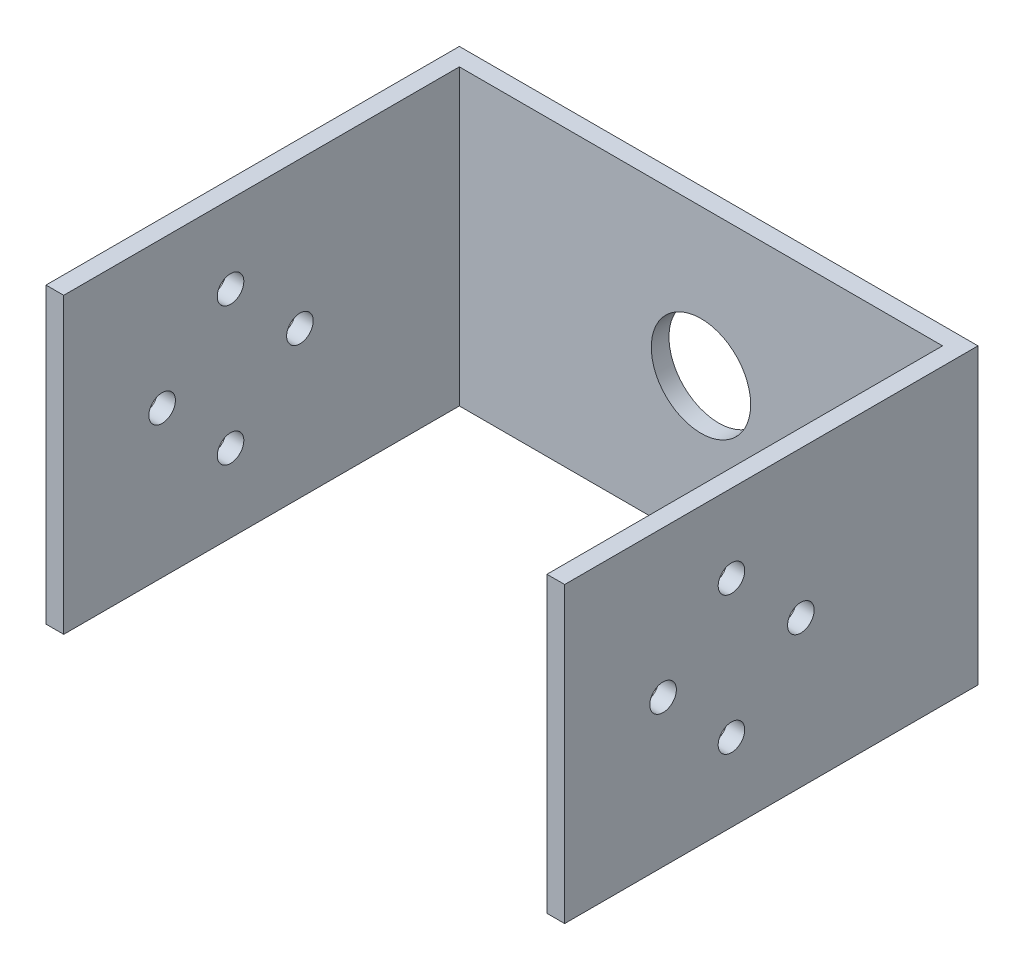
ISO-10303-21;
HEADER;
FILE_DESCRIPTION(('STEP AP214'),'2;1');
FILE_NAME('part.step','',(''),(''),'','','');
FILE_SCHEMA(('AUTOMOTIVE_DESIGN { 1 0 10303 214 1 1 1 1 }'));
ENDSEC;
DATA;
#1=APPLICATION_CONTEXT('core data for automotive mechanical design processes');
#2=APPLICATION_PROTOCOL_DEFINITION('international standard','automotive_design',2000,#1);
#3=PRODUCT_CONTEXT('',#1,'mechanical');
#4=PRODUCT('Part','Part','',(#3));
#5=PRODUCT_RELATED_PRODUCT_CATEGORY('part','',(#4));
#6=PRODUCT_DEFINITION_FORMATION('','',#4);
#7=PRODUCT_DEFINITION_CONTEXT('part definition',#1,'design');
#8=PRODUCT_DEFINITION('design','',#6,#7);
#9=PRODUCT_DEFINITION_SHAPE('','',#8);
#10=(LENGTH_UNIT() NAMED_UNIT(*) SI_UNIT(.MILLI.,.METRE.));
#11=(NAMED_UNIT(*) PLANE_ANGLE_UNIT() SI_UNIT($,.RADIAN.));
#12=(NAMED_UNIT(*) SI_UNIT($,.STERADIAN.) SOLID_ANGLE_UNIT());
#13=UNCERTAINTY_MEASURE_WITH_UNIT(LENGTH_MEASURE(1.E-05),#10,'distance_accuracy_value','');
#14=(GEOMETRIC_REPRESENTATION_CONTEXT(3) GLOBAL_UNCERTAINTY_ASSIGNED_CONTEXT((#13)) GLOBAL_UNIT_ASSIGNED_CONTEXT((#10,
#11,#12)) REPRESENTATION_CONTEXT('',''));
#15=CARTESIAN_POINT('',(0.,0.,0.));
#16=DIRECTION('',(0.,0.,1.));
#17=DIRECTION('',(1.,0.,0.));
#18=AXIS2_PLACEMENT_3D('',#15,#16,#17);
#19=CARTESIAN_POINT('',(0.,0.,1.8));
#20=DIRECTION('',(0.,0.,-1.));
#21=DIRECTION('',(-1.,0.,0.));
#22=AXIS2_PLACEMENT_3D('',#19,#20,#21);
#23=PLANE('',#22);
#24=DIRECTION('',(0.,1.,0.));
#25=VECTOR('',#24,1.);
#26=CARTESIAN_POINT('',(24.55,-14.92,1.8));
#27=LINE('',#26,#25);
#28=CARTESIAN_POINT('',(24.55,-14.92,1.8));
#29=VERTEX_POINT('',#28);
#30=CARTESIAN_POINT('',(24.55,14.92,1.8));
#31=VERTEX_POINT('',#30);
#32=EDGE_CURVE('E183',#29,#31,#27,.T.);
#33=ORIENTED_EDGE('',*,*,#32,.T.);
#34=DIRECTION('',(-1.,0.,0.));
#35=VECTOR('',#34,1.);
#36=CARTESIAN_POINT('',(-24.55,14.92,1.8));
#37=LINE('',#36,#35);
#38=CARTESIAN_POINT('',(-24.55,14.92,1.8));
#39=VERTEX_POINT('',#38);
#40=EDGE_CURVE('E186',#31,#39,#37,.T.);
#41=ORIENTED_EDGE('',*,*,#40,.T.);
#42=DIRECTION('',(0.,-1.,0.));
#43=VECTOR('',#42,1.);
#44=CARTESIAN_POINT('',(-24.55,-14.92,1.8));
#45=LINE('',#44,#43);
#46=CARTESIAN_POINT('',(-24.55,-14.92,1.8));
#47=VERTEX_POINT('',#46);
#48=EDGE_CURVE('E46',#39,#47,#45,.T.);
#49=ORIENTED_EDGE('',*,*,#48,.T.);
#50=DIRECTION('',(1.,0.,0.));
#51=VECTOR('',#50,1.);
#52=CARTESIAN_POINT('',(-24.55,-14.92,1.8));
#53=LINE('',#52,#51);
#54=EDGE_CURVE('E11',#47,#29,#53,.T.);
#55=ORIENTED_EDGE('',*,*,#54,.T.);
#56=EDGE_LOOP('',(#33,#41,#49,#55));
#57=FACE_BOUND('',#56,.T.);
#58=CARTESIAN_POINT('',(0.,0.,1.8));
#59=DIRECTION('',(0.,0.,1.));
#60=DIRECTION('',(1.,0.,0.));
#61=AXIS2_PLACEMENT_3D('',#58,#59,#60);
#62=CIRCLE('',#61,5.05);
#63=CARTESIAN_POINT('',(5.05,0.,1.8));
#64=VERTEX_POINT('',#63);
#65=EDGE_CURVE('E177',#64,#64,#62,.T.);
#66=ORIENTED_EDGE('',*,*,#65,.F.);
#67=EDGE_LOOP('',(#66));
#68=FACE_BOUND('',#67,.T.);
#69=ADVANCED_FACE('F37',(#57,#68),#23,.F.);
#70=CARTESIAN_POINT('',(0.,0.,0.));
#71=DIRECTION('',(0.,0.,-1.));
#72=DIRECTION('',(-1.,0.,0.));
#73=AXIS2_PLACEMENT_3D('',#70,#71,#72);
#74=PLANE('',#73);
#75=DIRECTION('',(-1.,0.,0.));
#76=VECTOR('',#75,1.);
#77=CARTESIAN_POINT('',(-24.55,14.92,0.));
#78=LINE('',#77,#76);
#79=CARTESIAN_POINT('',(26.35,14.92,0.));
#80=VERTEX_POINT('',#79);
#81=CARTESIAN_POINT('',(-26.35,14.92,0.));
#82=VERTEX_POINT('',#81);
#83=EDGE_CURVE('E180',#80,#82,#78,.T.);
#84=ORIENTED_EDGE('',*,*,#83,.F.);
#85=DIRECTION('',(0.,1.,0.));
#86=VECTOR('',#85,1.);
#87=CARTESIAN_POINT('',(26.35,14.92,0.));
#88=LINE('',#87,#86);
#89=CARTESIAN_POINT('',(26.35,-14.92,0.));
#90=VERTEX_POINT('',#89);
#91=EDGE_CURVE('E122',#90,#80,#88,.T.);
#92=ORIENTED_EDGE('',*,*,#91,.F.);
#93=DIRECTION('',(1.,0.,0.));
#94=VECTOR('',#93,1.);
#95=CARTESIAN_POINT('',(-24.55,-14.92,0.));
#96=LINE('',#95,#94);
#97=CARTESIAN_POINT('',(-26.35,-14.92,0.));
#98=VERTEX_POINT('',#97);
#99=EDGE_CURVE('E41',#98,#90,#96,.T.);
#100=ORIENTED_EDGE('',*,*,#99,.F.);
#101=DIRECTION('',(0.,-1.,0.));
#102=VECTOR('',#101,1.);
#103=CARTESIAN_POINT('',(-26.35,14.92,0.));
#104=LINE('',#103,#102);
#105=EDGE_CURVE('E158',#82,#98,#104,.T.);
#106=ORIENTED_EDGE('',*,*,#105,.F.);
#107=EDGE_LOOP('',(#84,#92,#100,#106));
#108=FACE_BOUND('',#107,.T.);
#109=CARTESIAN_POINT('',(0.,0.,0.));
#110=DIRECTION('',(0.,0.,1.));
#111=DIRECTION('',(1.,0.,0.));
#112=AXIS2_PLACEMENT_3D('',#109,#110,#111);
#113=CIRCLE('',#112,5.05);
#114=CARTESIAN_POINT('',(5.05,0.,0.));
#115=VERTEX_POINT('',#114);
#116=EDGE_CURVE('E176',#115,#115,#113,.T.);
#117=ORIENTED_EDGE('',*,*,#116,.T.);
#118=EDGE_LOOP('',(#117));
#119=FACE_BOUND('',#118,.T.);
#120=ADVANCED_FACE('F197',(#108,#119),#74,.T.);
#121=CARTESIAN_POINT('',(-24.55,14.92,1.8));
#122=DIRECTION('',(0.,-1.,0.));
#123=DIRECTION('',(0.,0.,-1.));
#124=AXIS2_PLACEMENT_3D('',#121,#122,#123);
#125=PLANE('',#124);
#126=ORIENTED_EDGE('',*,*,#83,.T.);
#127=DIRECTION('',(0.,0.,-1.));
#128=VECTOR('',#127,1.);
#129=CARTESIAN_POINT('',(-26.35,14.92,0.));
#130=LINE('',#129,#128);
#131=CARTESIAN_POINT('',(-26.35,14.92,42.));
#132=VERTEX_POINT('',#131);
#133=EDGE_CURVE('E155',#132,#82,#130,.T.);
#134=ORIENTED_EDGE('',*,*,#133,.F.);
#135=DIRECTION('',(1.,0.,0.));
#136=VECTOR('',#135,1.);
#137=CARTESIAN_POINT('',(-26.35,14.92,42.));
#138=LINE('',#137,#136);
#139=CARTESIAN_POINT('',(-24.55,14.92,42.));
#140=VERTEX_POINT('',#139);
#141=EDGE_CURVE('E166',#132,#140,#138,.T.);
#142=ORIENTED_EDGE('',*,*,#141,.T.);
#143=DIRECTION('',(0.,0.,-1.));
#144=VECTOR('',#143,1.);
#145=CARTESIAN_POINT('',(-24.55,14.92,0.));
#146=LINE('',#145,#144);
#147=EDGE_CURVE('E152',#140,#39,#146,.T.);
#148=ORIENTED_EDGE('',*,*,#147,.T.);
#149=ORIENTED_EDGE('',*,*,#40,.F.);
#150=DIRECTION('',(0.,0.,1.));
#151=VECTOR('',#150,1.);
#152=CARTESIAN_POINT('',(24.55,14.92,0.));
#153=LINE('',#152,#151);
#154=CARTESIAN_POINT('',(24.55,14.92,42.));
#155=VERTEX_POINT('',#154);
#156=EDGE_CURVE('E62',#31,#155,#153,.T.);
#157=ORIENTED_EDGE('',*,*,#156,.T.);
#158=DIRECTION('',(-1.,0.,0.));
#159=VECTOR('',#158,1.);
#160=CARTESIAN_POINT('',(26.35,14.92,42.));
#161=LINE('',#160,#159);
#162=CARTESIAN_POINT('',(26.35,14.92,42.));
#163=VERTEX_POINT('',#162);
#164=EDGE_CURVE('E108',#163,#155,#161,.T.);
#165=ORIENTED_EDGE('',*,*,#164,.F.);
#166=DIRECTION('',(0.,0.,1.));
#167=VECTOR('',#166,1.);
#168=CARTESIAN_POINT('',(26.35,14.92,0.));
#169=LINE('',#168,#167);
#170=EDGE_CURVE('E115',#80,#163,#169,.T.);
#171=ORIENTED_EDGE('',*,*,#170,.F.);
#172=EDGE_LOOP('',(#126,#134,#142,#148,#149,#157,#165,#171));
#173=FACE_BOUND('',#172,.T.);
#174=ADVANCED_FACE('F39',(#173),#125,.F.);
#175=CARTESIAN_POINT('',(-24.55,-14.92,1.8));
#176=DIRECTION('',(0.,1.,0.));
#177=DIRECTION('',(0.,0.,1.));
#178=AXIS2_PLACEMENT_3D('',#175,#176,#177);
#179=PLANE('',#178);
#180=ORIENTED_EDGE('',*,*,#99,.T.);
#181=DIRECTION('',(0.,0.,-1.));
#182=VECTOR('',#181,1.);
#183=CARTESIAN_POINT('',(26.35,-14.92,0.));
#184=LINE('',#183,#182);
#185=CARTESIAN_POINT('',(26.35,-14.92,42.));
#186=VERTEX_POINT('',#185);
#187=EDGE_CURVE('E114',#186,#90,#184,.T.);
#188=ORIENTED_EDGE('',*,*,#187,.F.);
#189=DIRECTION('',(-1.,0.,0.));
#190=VECTOR('',#189,1.);
#191=CARTESIAN_POINT('',(26.35,-14.92,42.));
#192=LINE('',#191,#190);
#193=CARTESIAN_POINT('',(24.55,-14.92,42.));
#194=VERTEX_POINT('',#193);
#195=EDGE_CURVE('E110',#186,#194,#192,.T.);
#196=ORIENTED_EDGE('',*,*,#195,.T.);
#197=DIRECTION('',(0.,0.,-1.));
#198=VECTOR('',#197,1.);
#199=CARTESIAN_POINT('',(24.55,-14.92,0.));
#200=LINE('',#199,#198);
#201=EDGE_CURVE('E124',#194,#29,#200,.T.);
#202=ORIENTED_EDGE('',*,*,#201,.T.);
#203=ORIENTED_EDGE('',*,*,#54,.F.);
#204=DIRECTION('',(0.,0.,1.));
#205=VECTOR('',#204,1.);
#206=CARTESIAN_POINT('',(-24.55,-14.92,0.));
#207=LINE('',#206,#205);
#208=CARTESIAN_POINT('',(-24.55,-14.92,42.));
#209=VERTEX_POINT('',#208);
#210=EDGE_CURVE('E54',#47,#209,#207,.T.);
#211=ORIENTED_EDGE('',*,*,#210,.T.);
#212=DIRECTION('',(1.,0.,0.));
#213=VECTOR('',#212,1.);
#214=CARTESIAN_POINT('',(-26.35,-14.92,42.));
#215=LINE('',#214,#213);
#216=CARTESIAN_POINT('',(-26.35,-14.92,42.));
#217=VERTEX_POINT('',#216);
#218=EDGE_CURVE('E173',#217,#209,#215,.T.);
#219=ORIENTED_EDGE('',*,*,#218,.F.);
#220=DIRECTION('',(0.,0.,1.));
#221=VECTOR('',#220,1.);
#222=CARTESIAN_POINT('',(-26.35,-14.92,0.));
#223=LINE('',#222,#221);
#224=EDGE_CURVE('E162',#98,#217,#223,.T.);
#225=ORIENTED_EDGE('',*,*,#224,.F.);
#226=EDGE_LOOP('',(#180,#188,#196,#202,#203,#211,#219,#225));
#227=FACE_BOUND('',#226,.T.);
#228=ADVANCED_FACE('F193',(#227),#179,.F.);
#229=CARTESIAN_POINT('',(0.,0.,1.8));
#230=DIRECTION('',(0.,0.,-1.));
#231=DIRECTION('',(-1.,0.,0.));
#232=AXIS2_PLACEMENT_3D('',#229,#230,#231);
#233=CYLINDRICAL_SURFACE('',#232,5.05);
#234=ORIENTED_EDGE('',*,*,#65,.T.);
#235=EDGE_LOOP('',(#234));
#236=FACE_BOUND('',#235,.T.);
#237=ORIENTED_EDGE('',*,*,#116,.F.);
#238=EDGE_LOOP('',(#237));
#239=FACE_BOUND('',#238,.T.);
#240=ADVANCED_FACE('F237',(#236,#239),#233,.F.);
#241=CARTESIAN_POINT('',(-24.55,0.,0.));
#242=DIRECTION('',(1.,0.,0.));
#243=DIRECTION('',(0.,0.,-1.));
#244=AXIS2_PLACEMENT_3D('',#241,#242,#243);
#245=PLANE('',#244);
#246=CARTESIAN_POINT('',(-24.55,-6.99999999999999,25.05));
#247=DIRECTION('',(-1.,0.,0.));
#248=DIRECTION('',(0.,0.,-1.));
#249=AXIS2_PLACEMENT_3D('',#246,#247,#248);
#250=CIRCLE('',#249,1.35);
#251=CARTESIAN_POINT('',(-24.55,-6.99999999999999,23.7));
#252=VERTEX_POINT('',#251);
#253=EDGE_CURVE('E126',#252,#252,#250,.T.);
#254=ORIENTED_EDGE('',*,*,#253,.T.);
#255=EDGE_LOOP('',(#254));
#256=FACE_BOUND('',#255,.T.);
#257=CARTESIAN_POINT('',(-24.55,7.00000000000001,25.05));
#258=DIRECTION('',(-1.,0.,0.));
#259=DIRECTION('',(0.,0.,1.));
#260=AXIS2_PLACEMENT_3D('',#257,#258,#259);
#261=CIRCLE('',#260,1.35);
#262=CARTESIAN_POINT('',(-24.55,7.00000000000001,26.4));
#263=VERTEX_POINT('',#262);
#264=EDGE_CURVE('E140',#263,#263,#261,.T.);
#265=ORIENTED_EDGE('',*,*,#264,.T.);
#266=EDGE_LOOP('',(#265));
#267=FACE_BOUND('',#266,.T.);
#268=CARTESIAN_POINT('',(-24.55,0.,32.));
#269=DIRECTION('',(-1.,0.,0.));
#270=DIRECTION('',(0.,0.,1.));
#271=AXIS2_PLACEMENT_3D('',#268,#269,#270);
#272=CIRCLE('',#271,1.35);
#273=CARTESIAN_POINT('',(-24.55,0.,33.35));
#274=VERTEX_POINT('',#273);
#275=EDGE_CURVE('E146',#274,#274,#272,.T.);
#276=ORIENTED_EDGE('',*,*,#275,.T.);
#277=EDGE_LOOP('',(#276));
#278=FACE_BOUND('',#277,.T.);
#279=CARTESIAN_POINT('',(-24.55,0.,18.));
#280=DIRECTION('',(-1.,0.,0.));
#281=DIRECTION('',(0.,0.,-1.));
#282=AXIS2_PLACEMENT_3D('',#279,#280,#281);
#283=CIRCLE('',#282,1.35);
#284=CARTESIAN_POINT('',(-24.55,0.,16.65));
#285=VERTEX_POINT('',#284);
#286=EDGE_CURVE('E135',#285,#285,#283,.T.);
#287=ORIENTED_EDGE('',*,*,#286,.T.);
#288=EDGE_LOOP('',(#287));
#289=FACE_BOUND('',#288,.T.);
#290=ORIENTED_EDGE('',*,*,#48,.F.);
#291=ORIENTED_EDGE('',*,*,#147,.F.);
#292=DIRECTION('',(0.,1.,0.));
#293=VECTOR('',#292,1.);
#294=CARTESIAN_POINT('',(-24.55,14.92,42.));
#295=LINE('',#294,#293);
#296=EDGE_CURVE('E159',#209,#140,#295,.T.);
#297=ORIENTED_EDGE('',*,*,#296,.F.);
#298=ORIENTED_EDGE('',*,*,#210,.F.);
#299=EDGE_LOOP('',(#290,#291,#297,#298));
#300=FACE_BOUND('',#299,.T.);
#301=ADVANCED_FACE('F210',(#256,#267,#278,#289,#300),#245,.T.);
#302=CARTESIAN_POINT('',(-26.35,0.,0.));
#303=DIRECTION('',(1.,0.,0.));
#304=DIRECTION('',(0.,0.,-1.));
#305=AXIS2_PLACEMENT_3D('',#302,#303,#304);
#306=PLANE('',#305);
#307=ORIENTED_EDGE('',*,*,#133,.T.);
#308=ORIENTED_EDGE('',*,*,#105,.T.);
#309=ORIENTED_EDGE('',*,*,#224,.T.);
#310=DIRECTION('',(0.,1.,0.));
#311=VECTOR('',#310,1.);
#312=CARTESIAN_POINT('',(-26.35,14.92,42.));
#313=LINE('',#312,#311);
#314=EDGE_CURVE('E164',#217,#132,#313,.T.);
#315=ORIENTED_EDGE('',*,*,#314,.T.);
#316=EDGE_LOOP('',(#307,#308,#309,#315));
#317=FACE_BOUND('',#316,.T.);
#318=CARTESIAN_POINT('',(-26.35,0.,32.));
#319=DIRECTION('',(-1.,0.,0.));
#320=DIRECTION('',(0.,0.,1.));
#321=AXIS2_PLACEMENT_3D('',#318,#319,#320);
#322=CIRCLE('',#321,1.35);
#323=CARTESIAN_POINT('',(-26.35,0.,33.35));
#324=VERTEX_POINT('',#323);
#325=EDGE_CURVE('E149',#324,#324,#322,.T.);
#326=ORIENTED_EDGE('',*,*,#325,.F.);
#327=EDGE_LOOP('',(#326));
#328=FACE_BOUND('',#327,.T.);
#329=CARTESIAN_POINT('',(-26.35,7.00000000000001,25.05));
#330=DIRECTION('',(-1.,0.,0.));
#331=DIRECTION('',(0.,0.,1.));
#332=AXIS2_PLACEMENT_3D('',#329,#330,#331);
#333=CIRCLE('',#332,1.35);
#334=CARTESIAN_POINT('',(-26.35,7.00000000000001,26.4));
#335=VERTEX_POINT('',#334);
#336=EDGE_CURVE('E143',#335,#335,#333,.T.);
#337=ORIENTED_EDGE('',*,*,#336,.F.);
#338=EDGE_LOOP('',(#337));
#339=FACE_BOUND('',#338,.T.);
#340=CARTESIAN_POINT('',(-26.35,0.,18.));
#341=DIRECTION('',(-1.,0.,0.));
#342=DIRECTION('',(0.,0.,-1.));
#343=AXIS2_PLACEMENT_3D('',#340,#341,#342);
#344=CIRCLE('',#343,1.35);
#345=CARTESIAN_POINT('',(-26.35,0.,16.65));
#346=VERTEX_POINT('',#345);
#347=EDGE_CURVE('E137',#346,#346,#344,.T.);
#348=ORIENTED_EDGE('',*,*,#347,.F.);
#349=EDGE_LOOP('',(#348));
#350=FACE_BOUND('',#349,.T.);
#351=CARTESIAN_POINT('',(-26.35,-6.99999999999999,25.05));
#352=DIRECTION('',(-1.,0.,0.));
#353=DIRECTION('',(0.,0.,-1.));
#354=AXIS2_PLACEMENT_3D('',#351,#352,#353);
#355=CIRCLE('',#354,1.35);
#356=CARTESIAN_POINT('',(-26.35,-6.99999999999999,23.7));
#357=VERTEX_POINT('',#356);
#358=EDGE_CURVE('E129',#357,#357,#355,.T.);
#359=ORIENTED_EDGE('',*,*,#358,.F.);
#360=EDGE_LOOP('',(#359));
#361=FACE_BOUND('',#360,.T.);
#362=ADVANCED_FACE('F216',(#317,#328,#339,#350,#361),#306,.F.);
#363=CARTESIAN_POINT('',(-26.35,14.92,42.));
#364=DIRECTION('',(0.,0.,-1.));
#365=DIRECTION('',(0.,1.,0.));
#366=AXIS2_PLACEMENT_3D('',#363,#364,#365);
#367=PLANE('',#366);
#368=ORIENTED_EDGE('',*,*,#296,.T.);
#369=ORIENTED_EDGE('',*,*,#141,.F.);
#370=ORIENTED_EDGE('',*,*,#314,.F.);
#371=ORIENTED_EDGE('',*,*,#218,.T.);
#372=EDGE_LOOP('',(#368,#369,#370,#371));
#373=FACE_BOUND('',#372,.T.);
#374=ADVANCED_FACE('F214',(#373),#367,.F.);
#375=CARTESIAN_POINT('',(-26.35,0.,32.));
#376=DIRECTION('',(1.,0.,0.));
#377=DIRECTION('',(0.,0.,-1.));
#378=AXIS2_PLACEMENT_3D('',#375,#376,#377);
#379=CYLINDRICAL_SURFACE('',#378,1.35);
#380=ORIENTED_EDGE('',*,*,#325,.T.);
#381=EDGE_LOOP('',(#380));
#382=FACE_BOUND('',#381,.T.);
#383=ORIENTED_EDGE('',*,*,#275,.F.);
#384=EDGE_LOOP('',(#383));
#385=FACE_BOUND('',#384,.T.);
#386=ADVANCED_FACE('F252',(#382,#385),#379,.F.);
#387=CARTESIAN_POINT('',(-26.35,7.00000000000001,25.05));
#388=DIRECTION('',(1.,0.,0.));
#389=DIRECTION('',(0.,0.,-1.));
#390=AXIS2_PLACEMENT_3D('',#387,#388,#389);
#391=CYLINDRICAL_SURFACE('',#390,1.35);
#392=ORIENTED_EDGE('',*,*,#336,.T.);
#393=EDGE_LOOP('',(#392));
#394=FACE_BOUND('',#393,.T.);
#395=ORIENTED_EDGE('',*,*,#264,.F.);
#396=EDGE_LOOP('',(#395));
#397=FACE_BOUND('',#396,.T.);
#398=ADVANCED_FACE('F246',(#394,#397),#391,.F.);
#399=CARTESIAN_POINT('',(-26.35,0.,18.));
#400=DIRECTION('',(1.,0.,0.));
#401=DIRECTION('',(0.,0.,-1.));
#402=AXIS2_PLACEMENT_3D('',#399,#400,#401);
#403=CYLINDRICAL_SURFACE('',#402,1.35);
#404=ORIENTED_EDGE('',*,*,#347,.T.);
#405=EDGE_LOOP('',(#404));
#406=FACE_BOUND('',#405,.T.);
#407=ORIENTED_EDGE('',*,*,#286,.F.);
#408=EDGE_LOOP('',(#407));
#409=FACE_BOUND('',#408,.T.);
#410=ADVANCED_FACE('F231',(#406,#409),#403,.F.);
#411=CARTESIAN_POINT('',(-26.35,-6.99999999999999,25.05));
#412=DIRECTION('',(1.,0.,0.));
#413=DIRECTION('',(0.,0.,-1.));
#414=AXIS2_PLACEMENT_3D('',#411,#412,#413);
#415=CYLINDRICAL_SURFACE('',#414,1.35);
#416=ORIENTED_EDGE('',*,*,#358,.T.);
#417=EDGE_LOOP('',(#416));
#418=FACE_BOUND('',#417,.T.);
#419=ORIENTED_EDGE('',*,*,#253,.F.);
#420=EDGE_LOOP('',(#419));
#421=FACE_BOUND('',#420,.T.);
#422=ADVANCED_FACE('F228',(#418,#421),#415,.F.);
#423=CARTESIAN_POINT('',(26.35,0.,0.));
#424=DIRECTION('',(1.,0.,0.));
#425=DIRECTION('',(0.,0.,-1.));
#426=AXIS2_PLACEMENT_3D('',#423,#424,#425);
#427=PLANE('',#426);
#428=CARTESIAN_POINT('',(26.35,7.00000000000001,25.05));
#429=DIRECTION('',(1.,0.,0.));
#430=DIRECTION('',(0.,0.,-1.));
#431=AXIS2_PLACEMENT_3D('',#428,#429,#430);
#432=CIRCLE('',#431,1.35);
#433=CARTESIAN_POINT('',(26.35,7.00000000000001,23.7));
#434=VERTEX_POINT('',#433);
#435=EDGE_CURVE('E435',#434,#434,#432,.T.);
#436=ORIENTED_EDGE('',*,*,#435,.F.);
#437=EDGE_LOOP('',(#436));
#438=FACE_BOUND('',#437,.T.);
#439=CARTESIAN_POINT('',(26.35,0.,18.));
#440=DIRECTION('',(1.,0.,0.));
#441=DIRECTION('',(0.,0.,-1.));
#442=AXIS2_PLACEMENT_3D('',#439,#440,#441);
#443=CIRCLE('',#442,1.35);
#444=CARTESIAN_POINT('',(26.35,0.,16.65));
#445=VERTEX_POINT('',#444);
#446=EDGE_CURVE('E203',#445,#445,#443,.T.);
#447=ORIENTED_EDGE('',*,*,#446,.F.);
#448=EDGE_LOOP('',(#447));
#449=FACE_BOUND('',#448,.T.);
#450=ORIENTED_EDGE('',*,*,#170,.T.);
#451=DIRECTION('',(0.,-1.,0.));
#452=VECTOR('',#451,1.);
#453=CARTESIAN_POINT('',(26.35,14.92,42.));
#454=LINE('',#453,#452);
#455=EDGE_CURVE('E104',#163,#186,#454,.T.);
#456=ORIENTED_EDGE('',*,*,#455,.T.);
#457=ORIENTED_EDGE('',*,*,#187,.T.);
#458=ORIENTED_EDGE('',*,*,#91,.T.);
#459=EDGE_LOOP('',(#450,#456,#457,#458));
#460=FACE_BOUND('',#459,.T.);
#461=CARTESIAN_POINT('',(26.35,0.,32.));
#462=DIRECTION('',(1.,0.,0.));
#463=DIRECTION('',(0.,0.,-1.));
#464=AXIS2_PLACEMENT_3D('',#461,#462,#463);
#465=CIRCLE('',#464,1.35);
#466=CARTESIAN_POINT('',(26.35,0.,30.65));
#467=VERTEX_POINT('',#466);
#468=EDGE_CURVE('E441',#467,#467,#465,.T.);
#469=ORIENTED_EDGE('',*,*,#468,.F.);
#470=EDGE_LOOP('',(#469));
#471=FACE_BOUND('',#470,.T.);
#472=CARTESIAN_POINT('',(26.35,-6.99999999999999,25.05));
#473=DIRECTION('',(1.,0.,0.));
#474=DIRECTION('',(0.,0.,-1.));
#475=AXIS2_PLACEMENT_3D('',#472,#473,#474);
#476=CIRCLE('',#475,1.34999999999999);
#477=CARTESIAN_POINT('',(26.35,-6.99999999999999,23.7));
#478=VERTEX_POINT('',#477);
#479=EDGE_CURVE('E426',#478,#478,#476,.T.);
#480=ORIENTED_EDGE('',*,*,#479,.F.);
#481=EDGE_LOOP('',(#480));
#482=FACE_BOUND('',#481,.T.);
#483=ADVANCED_FACE('F119',(#438,#449,#460,#471,#482),#427,.T.);
#484=CARTESIAN_POINT('',(24.55,0.,0.));
#485=DIRECTION('',(1.,0.,0.));
#486=DIRECTION('',(0.,0.,-1.));
#487=AXIS2_PLACEMENT_3D('',#484,#485,#486);
#488=PLANE('',#487);
#489=ORIENTED_EDGE('',*,*,#32,.F.);
#490=ORIENTED_EDGE('',*,*,#201,.F.);
#491=DIRECTION('',(0.,-1.,0.));
#492=VECTOR('',#491,1.);
#493=CARTESIAN_POINT('',(24.55,14.92,42.));
#494=LINE('',#493,#492);
#495=EDGE_CURVE('E202',#155,#194,#494,.T.);
#496=ORIENTED_EDGE('',*,*,#495,.F.);
#497=ORIENTED_EDGE('',*,*,#156,.F.);
#498=EDGE_LOOP('',(#489,#490,#496,#497));
#499=FACE_BOUND('',#498,.T.);
#500=CARTESIAN_POINT('',(24.55,0.,18.));
#501=DIRECTION('',(1.,0.,0.));
#502=DIRECTION('',(0.,0.,-1.));
#503=AXIS2_PLACEMENT_3D('',#500,#501,#502);
#504=CIRCLE('',#503,1.35);
#505=CARTESIAN_POINT('',(24.55,0.,16.65));
#506=VERTEX_POINT('',#505);
#507=EDGE_CURVE('E444',#506,#506,#504,.T.);
#508=ORIENTED_EDGE('',*,*,#507,.T.);
#509=EDGE_LOOP('',(#508));
#510=FACE_BOUND('',#509,.T.);
#511=CARTESIAN_POINT('',(24.55,0.,32.));
#512=DIRECTION('',(1.,0.,0.));
#513=DIRECTION('',(0.,0.,-1.));
#514=AXIS2_PLACEMENT_3D('',#511,#512,#513);
#515=CIRCLE('',#514,1.35);
#516=CARTESIAN_POINT('',(24.55,0.,30.65));
#517=VERTEX_POINT('',#516);
#518=EDGE_CURVE('E438',#517,#517,#515,.T.);
#519=ORIENTED_EDGE('',*,*,#518,.T.);
#520=EDGE_LOOP('',(#519));
#521=FACE_BOUND('',#520,.T.);
#522=CARTESIAN_POINT('',(24.55,7.00000000000001,25.05));
#523=DIRECTION('',(1.,0.,0.));
#524=DIRECTION('',(0.,0.,-1.));
#525=AXIS2_PLACEMENT_3D('',#522,#523,#524);
#526=CIRCLE('',#525,1.35);
#527=CARTESIAN_POINT('',(24.55,7.00000000000001,23.7));
#528=VERTEX_POINT('',#527);
#529=EDGE_CURVE('E432',#528,#528,#526,.T.);
#530=ORIENTED_EDGE('',*,*,#529,.T.);
#531=EDGE_LOOP('',(#530));
#532=FACE_BOUND('',#531,.T.);
#533=CARTESIAN_POINT('',(24.55,-6.99999999999999,25.05));
#534=DIRECTION('',(1.,0.,0.));
#535=DIRECTION('',(0.,0.,-1.));
#536=AXIS2_PLACEMENT_3D('',#533,#534,#535);
#537=CIRCLE('',#536,1.34999999999999);
#538=CARTESIAN_POINT('',(24.55,-6.99999999999999,23.7));
#539=VERTEX_POINT('',#538);
#540=EDGE_CURVE('E429',#539,#539,#537,.T.);
#541=ORIENTED_EDGE('',*,*,#540,.T.);
#542=EDGE_LOOP('',(#541));
#543=FACE_BOUND('',#542,.T.);
#544=ADVANCED_FACE('F363',(#499,#510,#521,#532,#543),#488,.F.);
#545=CARTESIAN_POINT('',(26.35,14.92,42.));
#546=DIRECTION('',(0.,0.,-1.));
#547=DIRECTION('',(0.,1.,0.));
#548=AXIS2_PLACEMENT_3D('',#545,#546,#547);
#549=PLANE('',#548);
#550=ORIENTED_EDGE('',*,*,#495,.T.);
#551=ORIENTED_EDGE('',*,*,#195,.F.);
#552=ORIENTED_EDGE('',*,*,#455,.F.);
#553=ORIENTED_EDGE('',*,*,#164,.T.);
#554=EDGE_LOOP('',(#550,#551,#552,#553));
#555=FACE_BOUND('',#554,.T.);
#556=ADVANCED_FACE('F106',(#555),#549,.F.);
#557=CARTESIAN_POINT('',(26.35,0.,18.));
#558=DIRECTION('',(-1.,0.,0.));
#559=DIRECTION('',(0.,0.,1.));
#560=AXIS2_PLACEMENT_3D('',#557,#558,#559);
#561=CYLINDRICAL_SURFACE('',#560,1.35);
#562=ORIENTED_EDGE('',*,*,#446,.T.);
#563=EDGE_LOOP('',(#562));
#564=FACE_BOUND('',#563,.T.);
#565=ORIENTED_EDGE('',*,*,#507,.F.);
#566=EDGE_LOOP('',(#565));
#567=FACE_BOUND('',#566,.T.);
#568=ADVANCED_FACE('F379',(#564,#567),#561,.F.);
#569=CARTESIAN_POINT('',(26.35,0.,32.));
#570=DIRECTION('',(-1.,0.,0.));
#571=DIRECTION('',(0.,0.,1.));
#572=AXIS2_PLACEMENT_3D('',#569,#570,#571);
#573=CYLINDRICAL_SURFACE('',#572,1.35);
#574=ORIENTED_EDGE('',*,*,#468,.T.);
#575=EDGE_LOOP('',(#574));
#576=FACE_BOUND('',#575,.T.);
#577=ORIENTED_EDGE('',*,*,#518,.F.);
#578=EDGE_LOOP('',(#577));
#579=FACE_BOUND('',#578,.T.);
#580=ADVANCED_FACE('F387',(#576,#579),#573,.F.);
#581=CARTESIAN_POINT('',(26.35,7.00000000000001,25.05));
#582=DIRECTION('',(-1.,0.,0.));
#583=DIRECTION('',(0.,0.,1.));
#584=AXIS2_PLACEMENT_3D('',#581,#582,#583);
#585=CYLINDRICAL_SURFACE('',#584,1.35);
#586=ORIENTED_EDGE('',*,*,#435,.T.);
#587=EDGE_LOOP('',(#586));
#588=FACE_BOUND('',#587,.T.);
#589=ORIENTED_EDGE('',*,*,#529,.F.);
#590=EDGE_LOOP('',(#589));
#591=FACE_BOUND('',#590,.T.);
#592=ADVANCED_FACE('F396',(#588,#591),#585,.F.);
#593=CARTESIAN_POINT('',(26.35,-6.99999999999999,25.05));
#594=DIRECTION('',(-1.,0.,0.));
#595=DIRECTION('',(0.,0.,1.));
#596=AXIS2_PLACEMENT_3D('',#593,#594,#595);
#597=CYLINDRICAL_SURFACE('',#596,1.34999999999999);
#598=ORIENTED_EDGE('',*,*,#479,.T.);
#599=EDGE_LOOP('',(#598));
#600=FACE_BOUND('',#599,.T.);
#601=ORIENTED_EDGE('',*,*,#540,.F.);
#602=EDGE_LOOP('',(#601));
#603=FACE_BOUND('',#602,.T.);
#604=ADVANCED_FACE('F405',(#600,#603),#597,.F.);
#605=CLOSED_SHELL('',(#69,#120,#174,#228,#240,#301,#362,#374,#386,#398,#410,#422,#483,#544,#556,
#568,#580,#592,#604));
#606=MANIFOLD_SOLID_BREP('B2',#605);
#607=ADVANCED_BREP_SHAPE_REPRESENTATION('',(#18,#606),#14);
#608=SHAPE_DEFINITION_REPRESENTATION(#9,#607);
ENDSEC;
END-ISO-10303-21;
